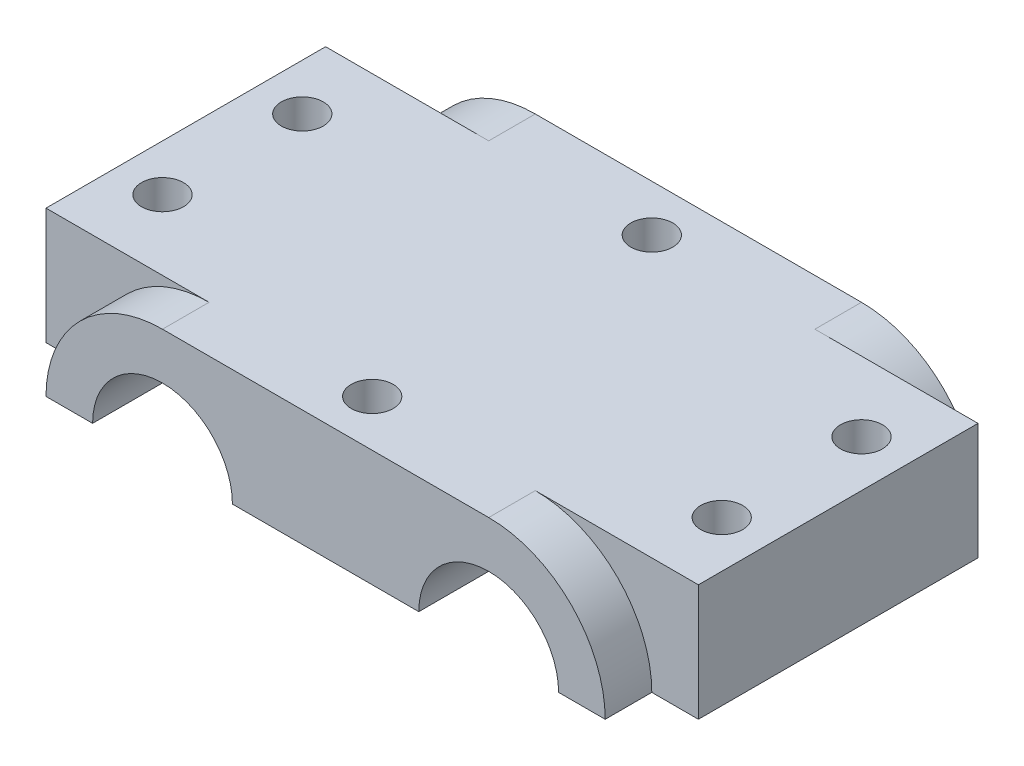
ISO-10303-21;
HEADER;
FILE_DESCRIPTION(('STEP AP214'),'2;1');
FILE_NAME('part.step','',(''),(''),'','','');
FILE_SCHEMA(('AUTOMOTIVE_DESIGN { 1 0 10303 214 1 1 1 1 }'));
ENDSEC;
DATA;
#1=APPLICATION_CONTEXT('core data for automotive mechanical design processes');
#2=APPLICATION_PROTOCOL_DEFINITION('international standard','automotive_design',2000,#1);
#3=PRODUCT_CONTEXT('',#1,'mechanical');
#4=PRODUCT('Part','Part','',(#3));
#5=PRODUCT_RELATED_PRODUCT_CATEGORY('part','',(#4));
#6=PRODUCT_DEFINITION_FORMATION('','',#4);
#7=PRODUCT_DEFINITION_CONTEXT('part definition',#1,'design');
#8=PRODUCT_DEFINITION('design','',#6,#7);
#9=PRODUCT_DEFINITION_SHAPE('','',#8);
#10=(LENGTH_UNIT() NAMED_UNIT(*) SI_UNIT(.MILLI.,.METRE.));
#11=(NAMED_UNIT(*) PLANE_ANGLE_UNIT() SI_UNIT($,.RADIAN.));
#12=(NAMED_UNIT(*) SI_UNIT($,.STERADIAN.) SOLID_ANGLE_UNIT());
#13=UNCERTAINTY_MEASURE_WITH_UNIT(LENGTH_MEASURE(1.E-05),#10,'distance_accuracy_value','');
#14=(GEOMETRIC_REPRESENTATION_CONTEXT(3) GLOBAL_UNCERTAINTY_ASSIGNED_CONTEXT((#13)) GLOBAL_UNIT_ASSIGNED_CONTEXT((#10,
#11,#12)) REPRESENTATION_CONTEXT('',''));
#15=CARTESIAN_POINT('',(0.,0.,0.));
#16=DIRECTION('',(0.,0.,1.));
#17=DIRECTION('',(1.,0.,0.));
#18=AXIS2_PLACEMENT_3D('',#15,#16,#17);
#19=CARTESIAN_POINT('',(0.,0.,-30.));
#20=DIRECTION('',(0.,0.,1.));
#21=DIRECTION('',(1.,0.,0.));
#22=AXIS2_PLACEMENT_3D('',#19,#20,#21);
#23=PLANE('',#22);
#24=CARTESIAN_POINT('',(-17.5,-6.25,-30.));
#25=DIRECTION('',(0.,0.,1.));
#26=DIRECTION('',(1.,0.,0.));
#27=AXIS2_PLACEMENT_3D('',#24,#25,#26);
#28=CIRCLE('',#27,12.5);
#29=CARTESIAN_POINT('',(-17.5,6.25,-30.));
#30=VERTEX_POINT('',#29);
#31=CARTESIAN_POINT('',(-30.,-6.25,-30.));
#32=VERTEX_POINT('',#31);
#33=EDGE_CURVE('E239',#30,#32,#28,.T.);
#34=ORIENTED_EDGE('',*,*,#33,.T.);
#35=DIRECTION('',(1.,0.,0.));
#36=VECTOR('',#35,1.);
#37=CARTESIAN_POINT('',(0.,-6.25000000000002,-30.));
#38=LINE('',#37,#36);
#39=CARTESIAN_POINT('',(-35.,-6.25,-30.));
#40=VERTEX_POINT('',#39);
#41=EDGE_CURVE('E184',#40,#32,#38,.T.);
#42=ORIENTED_EDGE('',*,*,#41,.F.);
#43=DIRECTION('',(0.,1.,0.));
#44=VECTOR('',#43,1.);
#45=CARTESIAN_POINT('',(-35.,0.,-30.));
#46=LINE('',#45,#44);
#47=CARTESIAN_POINT('',(-35.,6.25,-30.));
#48=VERTEX_POINT('',#47);
#49=EDGE_CURVE('E199',#40,#48,#46,.T.);
#50=ORIENTED_EDGE('',*,*,#49,.T.);
#51=DIRECTION('',(1.,0.,0.));
#52=VECTOR('',#51,1.);
#53=CARTESIAN_POINT('',(0.,6.25,-30.));
#54=LINE('',#53,#52);
#55=EDGE_CURVE('E261',#48,#30,#54,.T.);
#56=ORIENTED_EDGE('',*,*,#55,.T.);
#57=EDGE_LOOP('',(#34,#42,#50,#56));
#58=FACE_BOUND('',#57,.T.);
#59=ADVANCED_FACE('F39',(#58),#23,.F.);
#60=CARTESIAN_POINT('',(0.,6.25,5.));
#61=DIRECTION('',(0.,1.,0.));
#62=DIRECTION('',(0.,0.,1.));
#63=AXIS2_PLACEMENT_3D('',#60,#61,#62);
#64=PLANE('',#63);
#65=CARTESIAN_POINT('',(0.,6.25,0.));
#66=DIRECTION('',(0.,1.,0.));
#67=DIRECTION('',(0.,0.,1.));
#68=AXIS2_PLACEMENT_3D('',#65,#66,#67);
#69=CIRCLE('',#68,2.24999999999999);
#70=CARTESIAN_POINT('',(0.,6.25,2.24999999999999));
#71=VERTEX_POINT('',#70);
#72=EDGE_CURVE('E388',#71,#71,#69,.T.);
#73=ORIENTED_EDGE('',*,*,#72,.F.);
#74=EDGE_LOOP('',(#73));
#75=FACE_BOUND('',#74,.T.);
#76=CARTESIAN_POINT('',(0.,6.25,-30.));
#77=DIRECTION('',(0.,1.,0.));
#78=DIRECTION('',(0.,0.,1.));
#79=AXIS2_PLACEMENT_3D('',#76,#77,#78);
#80=CIRCLE('',#79,2.25);
#81=CARTESIAN_POINT('',(0.,6.25,-27.75));
#82=VERTEX_POINT('',#81);
#83=EDGE_CURVE('E382',#82,#82,#80,.T.);
#84=ORIENTED_EDGE('',*,*,#83,.F.);
#85=EDGE_LOOP('',(#84));
#86=FACE_BOUND('',#85,.T.);
#87=CARTESIAN_POINT('',(30.,6.25,-22.5));
#88=DIRECTION('',(0.,1.,0.));
#89=DIRECTION('',(0.,0.,1.));
#90=AXIS2_PLACEMENT_3D('',#87,#88,#89);
#91=CIRCLE('',#90,2.25);
#92=CARTESIAN_POINT('',(30.,6.25,-20.25));
#93=VERTEX_POINT('',#92);
#94=EDGE_CURVE('E376',#93,#93,#91,.T.);
#95=ORIENTED_EDGE('',*,*,#94,.F.);
#96=EDGE_LOOP('',(#95));
#97=FACE_BOUND('',#96,.T.);
#98=CARTESIAN_POINT('',(30.,6.25,-7.5));
#99=DIRECTION('',(0.,1.,0.));
#100=DIRECTION('',(0.,0.,1.));
#101=AXIS2_PLACEMENT_3D('',#98,#99,#100);
#102=CIRCLE('',#101,2.25);
#103=CARTESIAN_POINT('',(30.,6.25,-5.25));
#104=VERTEX_POINT('',#103);
#105=EDGE_CURVE('E370',#104,#104,#102,.T.);
#106=ORIENTED_EDGE('',*,*,#105,.F.);
#107=EDGE_LOOP('',(#106));
#108=FACE_BOUND('',#107,.T.);
#109=CARTESIAN_POINT('',(-30.,6.25,-7.5));
#110=DIRECTION('',(0.,1.,0.));
#111=DIRECTION('',(0.,0.,1.));
#112=AXIS2_PLACEMENT_3D('',#109,#110,#111);
#113=CIRCLE('',#112,2.25);
#114=CARTESIAN_POINT('',(-30.,6.25,-5.25));
#115=VERTEX_POINT('',#114);
#116=EDGE_CURVE('E364',#115,#115,#113,.T.);
#117=ORIENTED_EDGE('',*,*,#116,.F.);
#118=EDGE_LOOP('',(#117));
#119=FACE_BOUND('',#118,.T.);
#120=CARTESIAN_POINT('',(-30.,6.25,-22.5));
#121=DIRECTION('',(0.,1.,0.));
#122=DIRECTION('',(0.,0.,1.));
#123=AXIS2_PLACEMENT_3D('',#120,#121,#122);
#124=CIRCLE('',#123,2.25);
#125=CARTESIAN_POINT('',(-30.,6.25,-20.25));
#126=VERTEX_POINT('',#125);
#127=EDGE_CURVE('E358',#126,#126,#124,.T.);
#128=ORIENTED_EDGE('',*,*,#127,.F.);
#129=EDGE_LOOP('',(#128));
#130=FACE_BOUND('',#129,.T.);
#131=DIRECTION('',(1.,0.,0.));
#132=VECTOR('',#131,1.);
#133=CARTESIAN_POINT('',(0.,6.25,0.));
#134=LINE('',#133,#132);
#135=CARTESIAN_POINT('',(-35.,6.25,0.));
#136=VERTEX_POINT('',#135);
#137=CARTESIAN_POINT('',(-17.5,6.25,0.));
#138=VERTEX_POINT('',#137);
#139=EDGE_CURVE('E175',#136,#138,#134,.T.);
#140=ORIENTED_EDGE('',*,*,#139,.T.);
#141=DIRECTION('',(0.,0.,-1.));
#142=VECTOR('',#141,1.);
#143=CARTESIAN_POINT('',(-17.5,6.25,5.));
#144=LINE('',#143,#142);
#145=CARTESIAN_POINT('',(-17.5,6.25,5.));
#146=VERTEX_POINT('',#145);
#147=EDGE_CURVE('E11',#146,#138,#144,.T.);
#148=ORIENTED_EDGE('',*,*,#147,.F.);
#149=DIRECTION('',(1.,0.,0.));
#150=VECTOR('',#149,1.);
#151=CARTESIAN_POINT('',(0.,6.25,5.));
#152=LINE('',#151,#150);
#153=CARTESIAN_POINT('',(17.5,6.25,5.));
#154=VERTEX_POINT('',#153);
#155=EDGE_CURVE('E148',#146,#154,#152,.T.);
#156=ORIENTED_EDGE('',*,*,#155,.T.);
#157=DIRECTION('',(0.,0.,-1.));
#158=VECTOR('',#157,1.);
#159=CARTESIAN_POINT('',(17.5,6.25,5.));
#160=LINE('',#159,#158);
#161=CARTESIAN_POINT('',(17.5,6.25,0.));
#162=VERTEX_POINT('',#161);
#163=EDGE_CURVE('E63',#154,#162,#160,.T.);
#164=ORIENTED_EDGE('',*,*,#163,.T.);
#165=CARTESIAN_POINT('',(35.,6.25,0.));
#166=VERTEX_POINT('',#165);
#167=EDGE_CURVE('E89',#162,#166,#134,.T.);
#168=ORIENTED_EDGE('',*,*,#167,.T.);
#169=DIRECTION('',(0.,0.,1.));
#170=VECTOR('',#169,1.);
#171=CARTESIAN_POINT('',(35.,6.25,-30.));
#172=LINE('',#171,#170);
#173=CARTESIAN_POINT('',(35.,6.25,-30.));
#174=VERTEX_POINT('',#173);
#175=EDGE_CURVE('E193',#174,#166,#172,.T.);
#176=ORIENTED_EDGE('',*,*,#175,.F.);
#177=CARTESIAN_POINT('',(17.5,6.25,-30.));
#178=VERTEX_POINT('',#177);
#179=EDGE_CURVE('E260',#178,#174,#54,.T.);
#180=ORIENTED_EDGE('',*,*,#179,.F.);
#181=DIRECTION('',(0.,0.,1.));
#182=VECTOR('',#181,1.);
#183=CARTESIAN_POINT('',(17.5,6.25,-35.));
#184=LINE('',#183,#182);
#185=CARTESIAN_POINT('',(17.5,6.25,-35.));
#186=VERTEX_POINT('',#185);
#187=EDGE_CURVE('E54',#186,#178,#184,.T.);
#188=ORIENTED_EDGE('',*,*,#187,.F.);
#189=DIRECTION('',(1.,0.,0.));
#190=VECTOR('',#189,1.);
#191=CARTESIAN_POINT('',(0.,6.25,-35.));
#192=LINE('',#191,#190);
#193=CARTESIAN_POINT('',(-17.5,6.25,-35.));
#194=VERTEX_POINT('',#193);
#195=EDGE_CURVE('E227',#194,#186,#192,.T.);
#196=ORIENTED_EDGE('',*,*,#195,.F.);
#197=DIRECTION('',(0.,0.,1.));
#198=VECTOR('',#197,1.);
#199=CARTESIAN_POINT('',(-17.5,6.25,-35.));
#200=LINE('',#199,#198);
#201=EDGE_CURVE('E250',#194,#30,#200,.T.);
#202=ORIENTED_EDGE('',*,*,#201,.T.);
#203=ORIENTED_EDGE('',*,*,#55,.F.);
#204=DIRECTION('',(0.,0.,1.));
#205=VECTOR('',#204,1.);
#206=CARTESIAN_POINT('',(-35.,6.25,-30.));
#207=LINE('',#206,#205);
#208=EDGE_CURVE('E180',#48,#136,#207,.T.);
#209=ORIENTED_EDGE('',*,*,#208,.T.);
#210=EDGE_LOOP('',(#140,#148,#156,#164,#168,#176,#180,#188,#196,#202,#203,#209));
#211=FACE_BOUND('',#210,.T.);
#212=ADVANCED_FACE('F41',(#75,#86,#97,#108,#119,#130,#211),#64,.T.);
#213=CARTESIAN_POINT('',(-17.5,-6.25,5.));
#214=DIRECTION('',(0.,0.,-1.));
#215=DIRECTION('',(-1.,0.,0.));
#216=AXIS2_PLACEMENT_3D('',#213,#214,#215);
#217=CYLINDRICAL_SURFACE('',#216,12.5);
#218=CARTESIAN_POINT('',(-17.5,-6.25,0.));
#219=DIRECTION('',(0.,0.,1.));
#220=DIRECTION('',(1.,0.,0.));
#221=AXIS2_PLACEMENT_3D('',#218,#219,#220);
#222=CIRCLE('',#221,12.5);
#223=CARTESIAN_POINT('',(-30.,-6.25,0.));
#224=VERTEX_POINT('',#223);
#225=EDGE_CURVE('E143',#138,#224,#222,.T.);
#226=ORIENTED_EDGE('',*,*,#225,.T.);
#227=DIRECTION('',(0.,0.,-1.));
#228=VECTOR('',#227,1.);
#229=CARTESIAN_POINT('',(-30.,-6.25,5.));
#230=LINE('',#229,#228);
#231=CARTESIAN_POINT('',(-30.,-6.25,5.));
#232=VERTEX_POINT('',#231);
#233=EDGE_CURVE('E47',#232,#224,#230,.T.);
#234=ORIENTED_EDGE('',*,*,#233,.F.);
#235=CARTESIAN_POINT('',(-17.5,-6.25,5.));
#236=DIRECTION('',(0.,0.,1.));
#237=DIRECTION('',(1.,0.,0.));
#238=AXIS2_PLACEMENT_3D('',#235,#236,#237);
#239=CIRCLE('',#238,12.5);
#240=EDGE_CURVE('E170',#146,#232,#239,.T.);
#241=ORIENTED_EDGE('',*,*,#240,.F.);
#242=ORIENTED_EDGE('',*,*,#147,.T.);
#243=EDGE_LOOP('',(#226,#234,#241,#242));
#244=FACE_BOUND('',#243,.T.);
#245=ADVANCED_FACE('F169',(#244),#217,.T.);
#246=CARTESIAN_POINT('',(0.,-6.25000000000002,5.));
#247=DIRECTION('',(0.,1.,0.));
#248=DIRECTION('',(-1.,0.,0.));
#249=AXIS2_PLACEMENT_3D('',#246,#247,#248);
#250=PLANE('',#249);
#251=CARTESIAN_POINT('',(-30.,-6.25000000000001,-7.5));
#252=DIRECTION('',(0.,1.,0.));
#253=DIRECTION('',(0.,0.,1.));
#254=AXIS2_PLACEMENT_3D('',#251,#252,#253);
#255=CIRCLE('',#254,2.25);
#256=CARTESIAN_POINT('',(-30.,-6.25000000000001,-5.25));
#257=VERTEX_POINT('',#256);
#258=EDGE_CURVE('E361',#257,#257,#255,.T.);
#259=ORIENTED_EDGE('',*,*,#258,.T.);
#260=EDGE_LOOP('',(#259));
#261=FACE_BOUND('',#260,.T.);
#262=CARTESIAN_POINT('',(-30.,-6.25000000000001,-22.5));
#263=DIRECTION('',(0.,1.,0.));
#264=DIRECTION('',(0.,0.,1.));
#265=AXIS2_PLACEMENT_3D('',#262,#263,#264);
#266=CIRCLE('',#265,2.25);
#267=CARTESIAN_POINT('',(-30.,-6.25000000000001,-20.25));
#268=VERTEX_POINT('',#267);
#269=EDGE_CURVE('E243',#268,#268,#266,.T.);
#270=ORIENTED_EDGE('',*,*,#269,.T.);
#271=EDGE_LOOP('',(#270));
#272=FACE_BOUND('',#271,.T.);
#273=DIRECTION('',(1.,0.,0.));
#274=VECTOR('',#273,1.);
#275=CARTESIAN_POINT('',(0.,-6.25000000000002,-35.));
#276=LINE('',#275,#274);
#277=CARTESIAN_POINT('',(-30.,-6.25,-35.));
#278=VERTEX_POINT('',#277);
#279=CARTESIAN_POINT('',(-25.,-6.25000000000001,-35.));
#280=VERTEX_POINT('',#279);
#281=EDGE_CURVE('E212',#278,#280,#276,.T.);
#282=ORIENTED_EDGE('',*,*,#281,.T.);
#283=DIRECTION('',(0.,0.,-1.));
#284=VECTOR('',#283,1.);
#285=CARTESIAN_POINT('',(-25.,-6.25000000000001,5.));
#286=LINE('',#285,#284);
#287=CARTESIAN_POINT('',(-25.,-6.25000000000001,5.));
#288=VERTEX_POINT('',#287);
#289=EDGE_CURVE('E155',#288,#280,#286,.T.);
#290=ORIENTED_EDGE('',*,*,#289,.F.);
#291=DIRECTION('',(1.,0.,0.));
#292=VECTOR('',#291,1.);
#293=CARTESIAN_POINT('',(0.,-6.25000000000002,5.));
#294=LINE('',#293,#292);
#295=EDGE_CURVE('E166',#232,#288,#294,.T.);
#296=ORIENTED_EDGE('',*,*,#295,.F.);
#297=ORIENTED_EDGE('',*,*,#233,.T.);
#298=DIRECTION('',(1.,0.,0.));
#299=VECTOR('',#298,1.);
#300=CARTESIAN_POINT('',(0.,-6.25000000000002,0.));
#301=LINE('',#300,#299);
#302=CARTESIAN_POINT('',(-35.,-6.25,0.));
#303=VERTEX_POINT('',#302);
#304=EDGE_CURVE('E77',#303,#224,#301,.T.);
#305=ORIENTED_EDGE('',*,*,#304,.F.);
#306=DIRECTION('',(0.,0.,1.));
#307=VECTOR('',#306,1.);
#308=CARTESIAN_POINT('',(-35.,-6.25,-30.));
#309=LINE('',#308,#307);
#310=EDGE_CURVE('E146',#40,#303,#309,.T.);
#311=ORIENTED_EDGE('',*,*,#310,.F.);
#312=ORIENTED_EDGE('',*,*,#41,.T.);
#313=DIRECTION('',(0.,0.,1.));
#314=VECTOR('',#313,1.);
#315=CARTESIAN_POINT('',(-30.,-6.25,-35.));
#316=LINE('',#315,#314);
#317=EDGE_CURVE('E216',#278,#32,#316,.T.);
#318=ORIENTED_EDGE('',*,*,#317,.F.);
#319=EDGE_LOOP('',(#282,#290,#296,#297,#305,#311,#312,#318));
#320=FACE_BOUND('',#319,.T.);
#321=ADVANCED_FACE('F162',(#261,#272,#320),#250,.F.);
#322=CARTESIAN_POINT('',(-17.5,-6.25,5.));
#323=DIRECTION('',(0.,0.,-1.));
#324=DIRECTION('',(-1.,0.,0.));
#325=AXIS2_PLACEMENT_3D('',#322,#323,#324);
#326=CYLINDRICAL_SURFACE('',#325,7.5);
#327=CARTESIAN_POINT('',(-17.5,-6.25,-35.));
#328=DIRECTION('',(0.,0.,1.));
#329=DIRECTION('',(1.,0.,0.));
#330=AXIS2_PLACEMENT_3D('',#327,#328,#329);
#331=CIRCLE('',#330,7.5);
#332=CARTESIAN_POINT('',(-10.,-6.25,-35.));
#333=VERTEX_POINT('',#332);
#334=EDGE_CURVE('E222',#333,#280,#331,.T.);
#335=ORIENTED_EDGE('',*,*,#334,.F.);
#336=DIRECTION('',(0.,0.,-1.));
#337=VECTOR('',#336,1.);
#338=CARTESIAN_POINT('',(-10.,-6.25,5.));
#339=LINE('',#338,#337);
#340=CARTESIAN_POINT('',(-10.,-6.25,5.));
#341=VERTEX_POINT('',#340);
#342=EDGE_CURVE('E152',#341,#333,#339,.T.);
#343=ORIENTED_EDGE('',*,*,#342,.F.);
#344=CARTESIAN_POINT('',(-17.5,-6.25,5.));
#345=DIRECTION('',(0.,0.,1.));
#346=DIRECTION('',(1.,0.,0.));
#347=AXIS2_PLACEMENT_3D('',#344,#345,#346);
#348=CIRCLE('',#347,7.5);
#349=EDGE_CURVE('E203',#341,#288,#348,.T.);
#350=ORIENTED_EDGE('',*,*,#349,.T.);
#351=ORIENTED_EDGE('',*,*,#289,.T.);
#352=EDGE_LOOP('',(#335,#343,#350,#351));
#353=FACE_BOUND('',#352,.T.);
#354=ADVANCED_FACE('F207',(#353),#326,.F.);
#355=CARTESIAN_POINT('',(0.,-6.25,5.));
#356=DIRECTION('',(0.,1.,0.));
#357=DIRECTION('',(-1.,0.,0.));
#358=AXIS2_PLACEMENT_3D('',#355,#356,#357);
#359=PLANE('',#358);
#360=CARTESIAN_POINT('',(0.,-6.25000000000001,0.));
#361=DIRECTION('',(0.,1.,0.));
#362=DIRECTION('',(0.,0.,1.));
#363=AXIS2_PLACEMENT_3D('',#360,#361,#362);
#364=CIRCLE('',#363,2.25);
#365=CARTESIAN_POINT('',(0.,-6.25000000000001,2.25));
#366=VERTEX_POINT('',#365);
#367=EDGE_CURVE('E385',#366,#366,#364,.T.);
#368=ORIENTED_EDGE('',*,*,#367,.T.);
#369=EDGE_LOOP('',(#368));
#370=FACE_BOUND('',#369,.T.);
#371=CARTESIAN_POINT('',(0.,-6.25000000000001,-30.));
#372=DIRECTION('',(0.,1.,0.));
#373=DIRECTION('',(0.,0.,1.));
#374=AXIS2_PLACEMENT_3D('',#371,#372,#373);
#375=CIRCLE('',#374,2.25);
#376=CARTESIAN_POINT('',(0.,-6.25000000000001,-27.75));
#377=VERTEX_POINT('',#376);
#378=EDGE_CURVE('E379',#377,#377,#375,.T.);
#379=ORIENTED_EDGE('',*,*,#378,.T.);
#380=EDGE_LOOP('',(#379));
#381=FACE_BOUND('',#380,.T.);
#382=DIRECTION('',(1.,0.,0.));
#383=VECTOR('',#382,1.);
#384=CARTESIAN_POINT('',(0.,-6.25,-35.));
#385=LINE('',#384,#383);
#386=CARTESIAN_POINT('',(10.,-6.25,-35.));
#387=VERTEX_POINT('',#386);
#388=EDGE_CURVE('E225',#333,#387,#385,.T.);
#389=ORIENTED_EDGE('',*,*,#388,.T.);
#390=DIRECTION('',(0.,0.,-1.));
#391=VECTOR('',#390,1.);
#392=CARTESIAN_POINT('',(10.,-6.25,5.));
#393=LINE('',#392,#391);
#394=CARTESIAN_POINT('',(10.,-6.25,5.));
#395=VERTEX_POINT('',#394);
#396=EDGE_CURVE('E132',#395,#387,#393,.T.);
#397=ORIENTED_EDGE('',*,*,#396,.F.);
#398=DIRECTION('',(1.,0.,0.));
#399=VECTOR('',#398,1.);
#400=CARTESIAN_POINT('',(0.,-6.25,5.));
#401=LINE('',#400,#399);
#402=EDGE_CURVE('E117',#341,#395,#401,.T.);
#403=ORIENTED_EDGE('',*,*,#402,.F.);
#404=ORIENTED_EDGE('',*,*,#342,.T.);
#405=EDGE_LOOP('',(#389,#397,#403,#404));
#406=FACE_BOUND('',#405,.T.);
#407=ADVANCED_FACE('F514',(#370,#381,#406),#359,.F.);
#408=CARTESIAN_POINT('',(17.5,-6.25,5.));
#409=DIRECTION('',(0.,0.,-1.));
#410=DIRECTION('',(-1.,0.,0.));
#411=AXIS2_PLACEMENT_3D('',#408,#409,#410);
#412=CYLINDRICAL_SURFACE('',#411,7.5);
#413=CARTESIAN_POINT('',(17.5,-6.25,-35.));
#414=DIRECTION('',(0.,0.,1.));
#415=DIRECTION('',(1.,0.,0.));
#416=AXIS2_PLACEMENT_3D('',#413,#414,#415);
#417=CIRCLE('',#416,7.5);
#418=CARTESIAN_POINT('',(25.,-6.25,-35.));
#419=VERTEX_POINT('',#418);
#420=EDGE_CURVE('E128',#387,#419,#417,.F.);
#421=ORIENTED_EDGE('',*,*,#420,.T.);
#422=DIRECTION('',(0.,0.,-1.));
#423=VECTOR('',#422,1.);
#424=CARTESIAN_POINT('',(25.,-6.25,5.));
#425=LINE('',#424,#423);
#426=CARTESIAN_POINT('',(25.,-6.25,5.));
#427=VERTEX_POINT('',#426);
#428=EDGE_CURVE('E124',#427,#419,#425,.T.);
#429=ORIENTED_EDGE('',*,*,#428,.F.);
#430=CARTESIAN_POINT('',(17.5,-6.25,5.));
#431=DIRECTION('',(0.,0.,1.));
#432=DIRECTION('',(1.,0.,0.));
#433=AXIS2_PLACEMENT_3D('',#430,#431,#432);
#434=CIRCLE('',#433,7.5);
#435=EDGE_CURVE('E107',#395,#427,#434,.F.);
#436=ORIENTED_EDGE('',*,*,#435,.F.);
#437=ORIENTED_EDGE('',*,*,#396,.T.);
#438=EDGE_LOOP('',(#421,#429,#436,#437));
#439=FACE_BOUND('',#438,.T.);
#440=ADVANCED_FACE('F125',(#439),#412,.F.);
#441=CARTESIAN_POINT('',(0.,-6.25,5.));
#442=DIRECTION('',(0.,1.,0.));
#443=DIRECTION('',(0.,0.,1.));
#444=AXIS2_PLACEMENT_3D('',#441,#442,#443);
#445=PLANE('',#444);
#446=CARTESIAN_POINT('',(30.,-6.25000000000001,-22.5));
#447=DIRECTION('',(0.,1.,0.));
#448=DIRECTION('',(0.,0.,1.));
#449=AXIS2_PLACEMENT_3D('',#446,#447,#448);
#450=CIRCLE('',#449,2.25);
#451=CARTESIAN_POINT('',(30.,-6.25000000000001,-20.25));
#452=VERTEX_POINT('',#451);
#453=EDGE_CURVE('E373',#452,#452,#450,.T.);
#454=ORIENTED_EDGE('',*,*,#453,.T.);
#455=EDGE_LOOP('',(#454));
#456=FACE_BOUND('',#455,.T.);
#457=CARTESIAN_POINT('',(30.,-6.25000000000001,-7.5));
#458=DIRECTION('',(0.,1.,0.));
#459=DIRECTION('',(0.,0.,1.));
#460=AXIS2_PLACEMENT_3D('',#457,#458,#459);
#461=CIRCLE('',#460,2.25);
#462=CARTESIAN_POINT('',(30.,-6.25000000000001,-5.25));
#463=VERTEX_POINT('',#462);
#464=EDGE_CURVE('E367',#463,#463,#461,.T.);
#465=ORIENTED_EDGE('',*,*,#464,.T.);
#466=EDGE_LOOP('',(#465));
#467=FACE_BOUND('',#466,.T.);
#468=DIRECTION('',(1.,0.,0.));
#469=VECTOR('',#468,1.);
#470=CARTESIAN_POINT('',(0.,-6.25,0.));
#471=LINE('',#470,#469);
#472=CARTESIAN_POINT('',(30.,-6.25,0.));
#473=VERTEX_POINT('',#472);
#474=CARTESIAN_POINT('',(35.,-6.25,0.));
#475=VERTEX_POINT('',#474);
#476=EDGE_CURVE('E266',#473,#475,#471,.T.);
#477=ORIENTED_EDGE('',*,*,#476,.F.);
#478=DIRECTION('',(0.,0.,-1.));
#479=VECTOR('',#478,1.);
#480=CARTESIAN_POINT('',(30.,-6.25,5.));
#481=LINE('',#480,#479);
#482=CARTESIAN_POINT('',(30.,-6.25,5.));
#483=VERTEX_POINT('',#482);
#484=EDGE_CURVE('E133',#483,#473,#481,.T.);
#485=ORIENTED_EDGE('',*,*,#484,.F.);
#486=DIRECTION('',(1.,0.,0.));
#487=VECTOR('',#486,1.);
#488=CARTESIAN_POINT('',(0.,-6.25,5.));
#489=LINE('',#488,#487);
#490=EDGE_CURVE('E113',#427,#483,#489,.T.);
#491=ORIENTED_EDGE('',*,*,#490,.F.);
#492=ORIENTED_EDGE('',*,*,#428,.T.);
#493=DIRECTION('',(1.,0.,0.));
#494=VECTOR('',#493,1.);
#495=CARTESIAN_POINT('',(0.,-6.25,-35.));
#496=LINE('',#495,#494);
#497=CARTESIAN_POINT('',(30.,-6.25,-35.));
#498=VERTEX_POINT('',#497);
#499=EDGE_CURVE('E234',#419,#498,#496,.T.);
#500=ORIENTED_EDGE('',*,*,#499,.T.);
#501=DIRECTION('',(0.,0.,1.));
#502=VECTOR('',#501,1.);
#503=CARTESIAN_POINT('',(30.,-6.25,-35.));
#504=LINE('',#503,#502);
#505=CARTESIAN_POINT('',(30.,-6.25,-30.));
#506=VERTEX_POINT('',#505);
#507=EDGE_CURVE('E246',#498,#506,#504,.T.);
#508=ORIENTED_EDGE('',*,*,#507,.T.);
#509=DIRECTION('',(1.,0.,0.));
#510=VECTOR('',#509,1.);
#511=CARTESIAN_POINT('',(0.,-6.25,-30.));
#512=LINE('',#511,#510);
#513=CARTESIAN_POINT('',(35.,-6.25,-30.));
#514=VERTEX_POINT('',#513);
#515=EDGE_CURVE('E254',#506,#514,#512,.T.);
#516=ORIENTED_EDGE('',*,*,#515,.T.);
#517=DIRECTION('',(0.,0.,1.));
#518=VECTOR('',#517,1.);
#519=CARTESIAN_POINT('',(35.,-6.25,-30.));
#520=LINE('',#519,#518);
#521=EDGE_CURVE('E196',#514,#475,#520,.T.);
#522=ORIENTED_EDGE('',*,*,#521,.T.);
#523=EDGE_LOOP('',(#477,#485,#491,#492,#500,#508,#516,#522));
#524=FACE_BOUND('',#523,.T.);
#525=ADVANCED_FACE('F136',(#456,#467,#524),#445,.F.);
#526=CARTESIAN_POINT('',(17.5,-6.25,5.));
#527=DIRECTION('',(0.,0.,-1.));
#528=DIRECTION('',(-1.,0.,0.));
#529=AXIS2_PLACEMENT_3D('',#526,#527,#528);
#530=CYLINDRICAL_SURFACE('',#529,12.5);
#531=CARTESIAN_POINT('',(17.5,-6.25,0.));
#532=DIRECTION('',(0.,0.,1.));
#533=DIRECTION('',(1.,0.,0.));
#534=AXIS2_PLACEMENT_3D('',#531,#532,#533);
#535=CIRCLE('',#534,12.5);
#536=EDGE_CURVE('E145',#162,#473,#535,.F.);
#537=ORIENTED_EDGE('',*,*,#536,.F.);
#538=ORIENTED_EDGE('',*,*,#163,.F.);
#539=CARTESIAN_POINT('',(17.5,-6.25,5.));
#540=DIRECTION('',(0.,0.,1.));
#541=DIRECTION('',(1.,0.,0.));
#542=AXIS2_PLACEMENT_3D('',#539,#540,#541);
#543=CIRCLE('',#542,12.5);
#544=EDGE_CURVE('E138',#154,#483,#543,.F.);
#545=ORIENTED_EDGE('',*,*,#544,.T.);
#546=ORIENTED_EDGE('',*,*,#484,.T.);
#547=EDGE_LOOP('',(#537,#538,#545,#546));
#548=FACE_BOUND('',#547,.T.);
#549=ADVANCED_FACE('F317',(#548),#530,.T.);
#550=CARTESIAN_POINT('',(0.,0.,5.));
#551=DIRECTION('',(0.,0.,1.));
#552=DIRECTION('',(1.,0.,0.));
#553=AXIS2_PLACEMENT_3D('',#550,#551,#552);
#554=PLANE('',#553);
#555=ORIENTED_EDGE('',*,*,#155,.F.);
#556=ORIENTED_EDGE('',*,*,#240,.T.);
#557=ORIENTED_EDGE('',*,*,#295,.T.);
#558=ORIENTED_EDGE('',*,*,#349,.F.);
#559=ORIENTED_EDGE('',*,*,#402,.T.);
#560=ORIENTED_EDGE('',*,*,#435,.T.);
#561=ORIENTED_EDGE('',*,*,#490,.T.);
#562=ORIENTED_EDGE('',*,*,#544,.F.);
#563=EDGE_LOOP('',(#555,#556,#557,#558,#559,#560,#561,#562));
#564=FACE_BOUND('',#563,.T.);
#565=ADVANCED_FACE('F110',(#564),#554,.T.);
#566=CARTESIAN_POINT('',(0.,0.,0.));
#567=DIRECTION('',(0.,0.,1.));
#568=DIRECTION('',(1.,0.,0.));
#569=AXIS2_PLACEMENT_3D('',#566,#567,#568);
#570=PLANE('',#569);
#571=ORIENTED_EDGE('',*,*,#167,.F.);
#572=ORIENTED_EDGE('',*,*,#536,.T.);
#573=ORIENTED_EDGE('',*,*,#476,.T.);
#574=DIRECTION('',(0.,1.,0.));
#575=VECTOR('',#574,1.);
#576=CARTESIAN_POINT('',(35.,0.,0.));
#577=LINE('',#576,#575);
#578=EDGE_CURVE('E186',#475,#166,#577,.T.);
#579=ORIENTED_EDGE('',*,*,#578,.T.);
#580=EDGE_LOOP('',(#571,#572,#573,#579));
#581=FACE_BOUND('',#580,.T.);
#582=ADVANCED_FACE('F271',(#581),#570,.T.);
#583=CARTESIAN_POINT('',(-35.,0.,-30.));
#584=DIRECTION('',(1.,0.,0.));
#585=DIRECTION('',(0.,0.,-1.));
#586=AXIS2_PLACEMENT_3D('',#583,#584,#585);
#587=PLANE('',#586);
#588=DIRECTION('',(0.,1.,0.));
#589=VECTOR('',#588,1.);
#590=CARTESIAN_POINT('',(-35.,0.,0.));
#591=LINE('',#590,#589);
#592=EDGE_CURVE('E181',#303,#136,#591,.T.);
#593=ORIENTED_EDGE('',*,*,#592,.T.);
#594=ORIENTED_EDGE('',*,*,#208,.F.);
#595=ORIENTED_EDGE('',*,*,#49,.F.);
#596=ORIENTED_EDGE('',*,*,#310,.T.);
#597=EDGE_LOOP('',(#593,#594,#595,#596));
#598=FACE_BOUND('',#597,.T.);
#599=ADVANCED_FACE('F341',(#598),#587,.F.);
#600=CARTESIAN_POINT('',(35.,0.,-30.));
#601=DIRECTION('',(1.,0.,0.));
#602=DIRECTION('',(0.,0.,-1.));
#603=AXIS2_PLACEMENT_3D('',#600,#601,#602);
#604=PLANE('',#603);
#605=ORIENTED_EDGE('',*,*,#578,.F.);
#606=ORIENTED_EDGE('',*,*,#521,.F.);
#607=DIRECTION('',(0.,1.,0.));
#608=VECTOR('',#607,1.);
#609=CARTESIAN_POINT('',(35.,0.,-30.));
#610=LINE('',#609,#608);
#611=EDGE_CURVE('E257',#514,#174,#610,.T.);
#612=ORIENTED_EDGE('',*,*,#611,.T.);
#613=ORIENTED_EDGE('',*,*,#175,.T.);
#614=EDGE_LOOP('',(#605,#606,#612,#613));
#615=FACE_BOUND('',#614,.T.);
#616=ADVANCED_FACE('F275',(#615),#604,.T.);
#617=ORIENTED_EDGE('',*,*,#515,.F.);
#618=CARTESIAN_POINT('',(17.5,-6.25,-30.));
#619=DIRECTION('',(0.,0.,1.));
#620=DIRECTION('',(1.,0.,0.));
#621=AXIS2_PLACEMENT_3D('',#618,#619,#620);
#622=CIRCLE('',#621,12.5);
#623=EDGE_CURVE('E242',#178,#506,#622,.F.);
#624=ORIENTED_EDGE('',*,*,#623,.F.);
#625=ORIENTED_EDGE('',*,*,#179,.T.);
#626=ORIENTED_EDGE('',*,*,#611,.F.);
#627=EDGE_LOOP('',(#617,#624,#625,#626));
#628=FACE_BOUND('',#627,.T.);
#629=ADVANCED_FACE('F316',(#628),#23,.F.);
#630=ORIENTED_EDGE('',*,*,#225,.F.);
#631=ORIENTED_EDGE('',*,*,#139,.F.);
#632=ORIENTED_EDGE('',*,*,#592,.F.);
#633=ORIENTED_EDGE('',*,*,#304,.T.);
#634=EDGE_LOOP('',(#630,#631,#632,#633));
#635=FACE_BOUND('',#634,.T.);
#636=ADVANCED_FACE('F173',(#635),#570,.T.);
#637=CARTESIAN_POINT('',(-17.5,-6.25,-35.));
#638=DIRECTION('',(0.,0.,1.));
#639=DIRECTION('',(-1.,0.,0.));
#640=AXIS2_PLACEMENT_3D('',#637,#638,#639);
#641=CYLINDRICAL_SURFACE('',#640,12.5);
#642=ORIENTED_EDGE('',*,*,#33,.F.);
#643=ORIENTED_EDGE('',*,*,#201,.F.);
#644=CARTESIAN_POINT('',(-17.5,-6.25,-35.));
#645=DIRECTION('',(0.,0.,1.));
#646=DIRECTION('',(1.,0.,0.));
#647=AXIS2_PLACEMENT_3D('',#644,#645,#646);
#648=CIRCLE('',#647,12.5);
#649=EDGE_CURVE('E223',#194,#278,#648,.T.);
#650=ORIENTED_EDGE('',*,*,#649,.T.);
#651=ORIENTED_EDGE('',*,*,#317,.T.);
#652=EDGE_LOOP('',(#642,#643,#650,#651));
#653=FACE_BOUND('',#652,.T.);
#654=ADVANCED_FACE('F340',(#653),#641,.T.);
#655=CARTESIAN_POINT('',(17.5,-6.25,-35.));
#656=DIRECTION('',(0.,0.,1.));
#657=DIRECTION('',(-1.,0.,0.));
#658=AXIS2_PLACEMENT_3D('',#655,#656,#657);
#659=CYLINDRICAL_SURFACE('',#658,12.5);
#660=ORIENTED_EDGE('',*,*,#623,.T.);
#661=ORIENTED_EDGE('',*,*,#507,.F.);
#662=CARTESIAN_POINT('',(17.5,-6.25,-35.));
#663=DIRECTION('',(0.,0.,1.));
#664=DIRECTION('',(1.,0.,0.));
#665=AXIS2_PLACEMENT_3D('',#662,#663,#664);
#666=CIRCLE('',#665,12.5);
#667=EDGE_CURVE('E236',#186,#498,#666,.F.);
#668=ORIENTED_EDGE('',*,*,#667,.F.);
#669=ORIENTED_EDGE('',*,*,#187,.T.);
#670=EDGE_LOOP('',(#660,#661,#668,#669));
#671=FACE_BOUND('',#670,.T.);
#672=ADVANCED_FACE('F312',(#671),#659,.T.);
#673=CARTESIAN_POINT('',(0.,0.,-35.));
#674=DIRECTION('',(0.,0.,-1.));
#675=DIRECTION('',(1.,0.,0.));
#676=AXIS2_PLACEMENT_3D('',#673,#674,#675);
#677=PLANE('',#676);
#678=ORIENTED_EDGE('',*,*,#195,.T.);
#679=ORIENTED_EDGE('',*,*,#667,.T.);
#680=ORIENTED_EDGE('',*,*,#499,.F.);
#681=ORIENTED_EDGE('',*,*,#420,.F.);
#682=ORIENTED_EDGE('',*,*,#388,.F.);
#683=ORIENTED_EDGE('',*,*,#334,.T.);
#684=ORIENTED_EDGE('',*,*,#281,.F.);
#685=ORIENTED_EDGE('',*,*,#649,.F.);
#686=EDGE_LOOP('',(#678,#679,#680,#681,#682,#683,#684,#685));
#687=FACE_BOUND('',#686,.T.);
#688=ADVANCED_FACE('F407',(#687),#677,.T.);
#689=CARTESIAN_POINT('',(-30.,6.25,-22.5));
#690=DIRECTION('',(0.,1.,0.));
#691=DIRECTION('',(0.,0.,1.));
#692=AXIS2_PLACEMENT_3D('',#689,#690,#691);
#693=CYLINDRICAL_SURFACE('',#692,2.25);
#694=ORIENTED_EDGE('',*,*,#269,.F.);
#695=EDGE_LOOP('',(#694));
#696=FACE_BOUND('',#695,.T.);
#697=ORIENTED_EDGE('',*,*,#127,.T.);
#698=EDGE_LOOP('',(#697));
#699=FACE_BOUND('',#698,.T.);
#700=ADVANCED_FACE('F404',(#696,#699),#693,.F.);
#701=CARTESIAN_POINT('',(-30.,6.25,-7.5));
#702=DIRECTION('',(0.,1.,0.));
#703=DIRECTION('',(0.,0.,1.));
#704=AXIS2_PLACEMENT_3D('',#701,#702,#703);
#705=CYLINDRICAL_SURFACE('',#704,2.25);
#706=ORIENTED_EDGE('',*,*,#258,.F.);
#707=EDGE_LOOP('',(#706));
#708=FACE_BOUND('',#707,.T.);
#709=ORIENTED_EDGE('',*,*,#116,.T.);
#710=EDGE_LOOP('',(#709));
#711=FACE_BOUND('',#710,.T.);
#712=ADVANCED_FACE('F406',(#708,#711),#705,.F.);
#713=CARTESIAN_POINT('',(30.,6.25,-7.5));
#714=DIRECTION('',(0.,1.,0.));
#715=DIRECTION('',(0.,0.,1.));
#716=AXIS2_PLACEMENT_3D('',#713,#714,#715);
#717=CYLINDRICAL_SURFACE('',#716,2.25);
#718=ORIENTED_EDGE('',*,*,#464,.F.);
#719=EDGE_LOOP('',(#718));
#720=FACE_BOUND('',#719,.T.);
#721=ORIENTED_EDGE('',*,*,#105,.T.);
#722=EDGE_LOOP('',(#721));
#723=FACE_BOUND('',#722,.T.);
#724=ADVANCED_FACE('F414',(#720,#723),#717,.F.);
#725=CARTESIAN_POINT('',(30.,6.25,-22.5));
#726=DIRECTION('',(0.,1.,0.));
#727=DIRECTION('',(0.,0.,1.));
#728=AXIS2_PLACEMENT_3D('',#725,#726,#727);
#729=CYLINDRICAL_SURFACE('',#728,2.25);
#730=ORIENTED_EDGE('',*,*,#453,.F.);
#731=EDGE_LOOP('',(#730));
#732=FACE_BOUND('',#731,.T.);
#733=ORIENTED_EDGE('',*,*,#94,.T.);
#734=EDGE_LOOP('',(#733));
#735=FACE_BOUND('',#734,.T.);
#736=ADVANCED_FACE('F478',(#732,#735),#729,.F.);
#737=CARTESIAN_POINT('',(0.,6.25,-30.));
#738=DIRECTION('',(0.,1.,0.));
#739=DIRECTION('',(0.,0.,1.));
#740=AXIS2_PLACEMENT_3D('',#737,#738,#739);
#741=CYLINDRICAL_SURFACE('',#740,2.25);
#742=ORIENTED_EDGE('',*,*,#378,.F.);
#743=EDGE_LOOP('',(#742));
#744=FACE_BOUND('',#743,.T.);
#745=ORIENTED_EDGE('',*,*,#83,.T.);
#746=EDGE_LOOP('',(#745));
#747=FACE_BOUND('',#746,.T.);
#748=ADVANCED_FACE('F488',(#744,#747),#741,.F.);
#749=CARTESIAN_POINT('',(0.,6.25,0.));
#750=DIRECTION('',(0.,1.,0.));
#751=DIRECTION('',(0.,0.,1.));
#752=AXIS2_PLACEMENT_3D('',#749,#750,#751);
#753=CYLINDRICAL_SURFACE('',#752,2.24999999999999);
#754=ORIENTED_EDGE('',*,*,#367,.F.);
#755=EDGE_LOOP('',(#754));
#756=FACE_BOUND('',#755,.T.);
#757=ORIENTED_EDGE('',*,*,#72,.T.);
#758=EDGE_LOOP('',(#757));
#759=FACE_BOUND('',#758,.T.);
#760=ADVANCED_FACE('F392',(#756,#759),#753,.F.);
#761=CLOSED_SHELL('',(#59,#212,#245,#321,#354,#407,#440,#525,#549,#565,#582,#599,#616,#629,#636,
#654,#672,#688,#700,#712,#724,#736,#748,#760));
#762=MANIFOLD_SOLID_BREP('B2',#761);
#763=ADVANCED_BREP_SHAPE_REPRESENTATION('',(#18,#762),#14);
#764=SHAPE_DEFINITION_REPRESENTATION(#9,#763);
ENDSEC;
END-ISO-10303-21;
